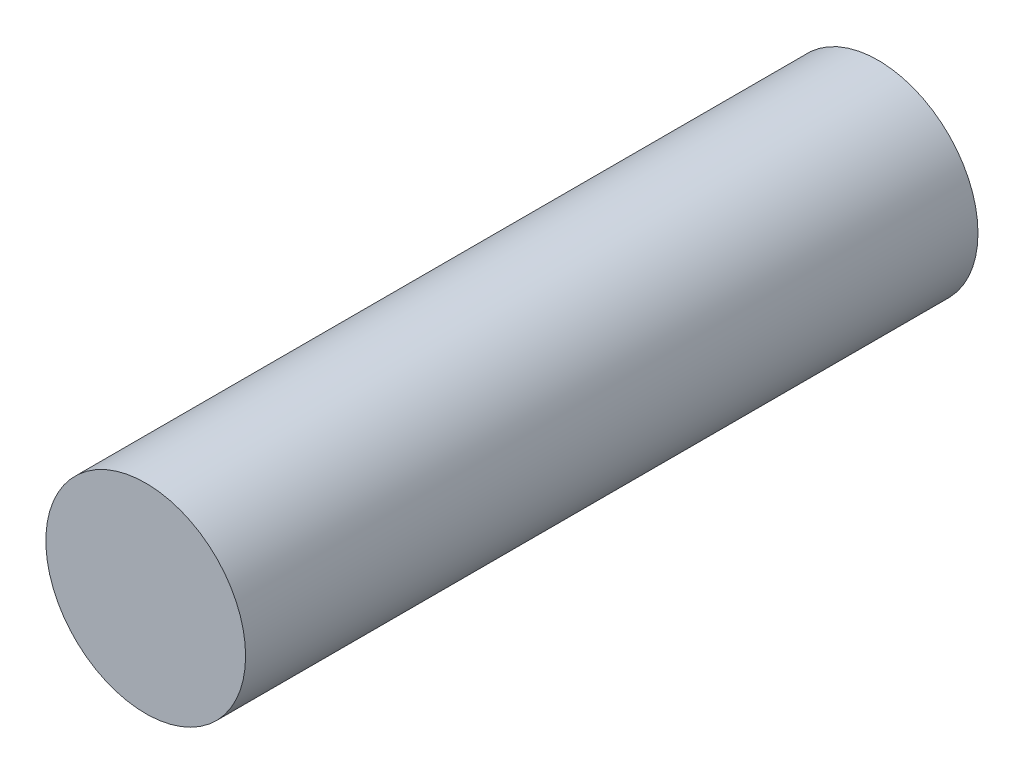
ISO-10303-21;
HEADER;
FILE_DESCRIPTION(('STEP AP214'),'2;1');
FILE_NAME('part.step','',(''),(''),'','','');
FILE_SCHEMA(('AUTOMOTIVE_DESIGN { 1 0 10303 214 1 1 1 1 }'));
ENDSEC;
DATA;
#1=APPLICATION_CONTEXT('core data for automotive mechanical design processes');
#2=APPLICATION_PROTOCOL_DEFINITION('international standard','automotive_design',2000,#1);
#3=PRODUCT_CONTEXT('',#1,'mechanical');
#4=PRODUCT('Part','Part','',(#3));
#5=PRODUCT_RELATED_PRODUCT_CATEGORY('part','',(#4));
#6=PRODUCT_DEFINITION_FORMATION('','',#4);
#7=PRODUCT_DEFINITION_CONTEXT('part definition',#1,'design');
#8=PRODUCT_DEFINITION('design','',#6,#7);
#9=PRODUCT_DEFINITION_SHAPE('','',#8);
#10=(LENGTH_UNIT() NAMED_UNIT(*) SI_UNIT(.MILLI.,.METRE.));
#11=(NAMED_UNIT(*) PLANE_ANGLE_UNIT() SI_UNIT($,.RADIAN.));
#12=(NAMED_UNIT(*) SI_UNIT($,.STERADIAN.) SOLID_ANGLE_UNIT());
#13=UNCERTAINTY_MEASURE_WITH_UNIT(LENGTH_MEASURE(1.E-05),#10,'distance_accuracy_value','');
#14=(GEOMETRIC_REPRESENTATION_CONTEXT(3) GLOBAL_UNCERTAINTY_ASSIGNED_CONTEXT((#13)) GLOBAL_UNIT_ASSIGNED_CONTEXT((#10,
#11,#12)) REPRESENTATION_CONTEXT('',''));
#15=CARTESIAN_POINT('',(0.,0.,0.));
#16=DIRECTION('',(0.,0.,1.));
#17=DIRECTION('',(1.,0.,0.));
#18=AXIS2_PLACEMENT_3D('',#15,#16,#17);
#19=CARTESIAN_POINT('',(0.,0.,66.));
#20=DIRECTION('',(0.,0.,-1.));
#21=DIRECTION('',(-1.,0.,0.));
#22=AXIS2_PLACEMENT_3D('',#19,#20,#21);
#23=CYLINDRICAL_SURFACE('',#22,9.);
#24=CARTESIAN_POINT('',(0.,0.,66.));
#25=DIRECTION('',(0.,0.,1.));
#26=DIRECTION('',(1.,0.,0.));
#27=AXIS2_PLACEMENT_3D('',#24,#25,#26);
#28=CIRCLE('',#27,9.);
#29=CARTESIAN_POINT('',(9.,0.,66.));
#30=VERTEX_POINT('',#29);
#31=EDGE_CURVE('E10',#30,#30,#28,.T.);
#32=ORIENTED_EDGE('',*,*,#31,.F.);
#33=EDGE_LOOP('',(#32));
#34=FACE_BOUND('',#33,.T.);
#35=CARTESIAN_POINT('',(0.,0.,0.));
#36=DIRECTION('',(0.,0.,1.));
#37=DIRECTION('',(1.,0.,0.));
#38=AXIS2_PLACEMENT_3D('',#35,#36,#37);
#39=CIRCLE('',#38,9.);
#40=CARTESIAN_POINT('',(9.,0.,0.));
#41=VERTEX_POINT('',#40);
#42=EDGE_CURVE('E42',#41,#41,#39,.T.);
#43=ORIENTED_EDGE('',*,*,#42,.T.);
#44=EDGE_LOOP('',(#43));
#45=FACE_BOUND('',#44,.T.);
#46=ADVANCED_FACE('F39',(#34,#45),#23,.T.);
#47=CARTESIAN_POINT('',(0.,0.,66.));
#48=DIRECTION('',(0.,0.,1.));
#49=DIRECTION('',(1.,0.,0.));
#50=AXIS2_PLACEMENT_3D('',#47,#48,#49);
#51=PLANE('',#50);
#52=ORIENTED_EDGE('',*,*,#31,.T.);
#53=EDGE_LOOP('',(#52));
#54=FACE_BOUND('',#53,.T.);
#55=ADVANCED_FACE('F54',(#54),#51,.T.);
#56=CARTESIAN_POINT('',(0.,0.,0.));
#57=DIRECTION('',(0.,0.,1.));
#58=DIRECTION('',(1.,0.,0.));
#59=AXIS2_PLACEMENT_3D('',#56,#57,#58);
#60=PLANE('',#59);
#61=ORIENTED_EDGE('',*,*,#42,.F.);
#62=EDGE_LOOP('',(#61));
#63=FACE_BOUND('',#62,.T.);
#64=ADVANCED_FACE('F52',(#63),#60,.F.);
#65=CLOSED_SHELL('',(#46,#55,#64));
#66=MANIFOLD_SOLID_BREP('B2',#65);
#67=ADVANCED_BREP_SHAPE_REPRESENTATION('',(#18,#66),#14);
#68=SHAPE_DEFINITION_REPRESENTATION(#9,#67);
ENDSEC;
END-ISO-10303-21;
